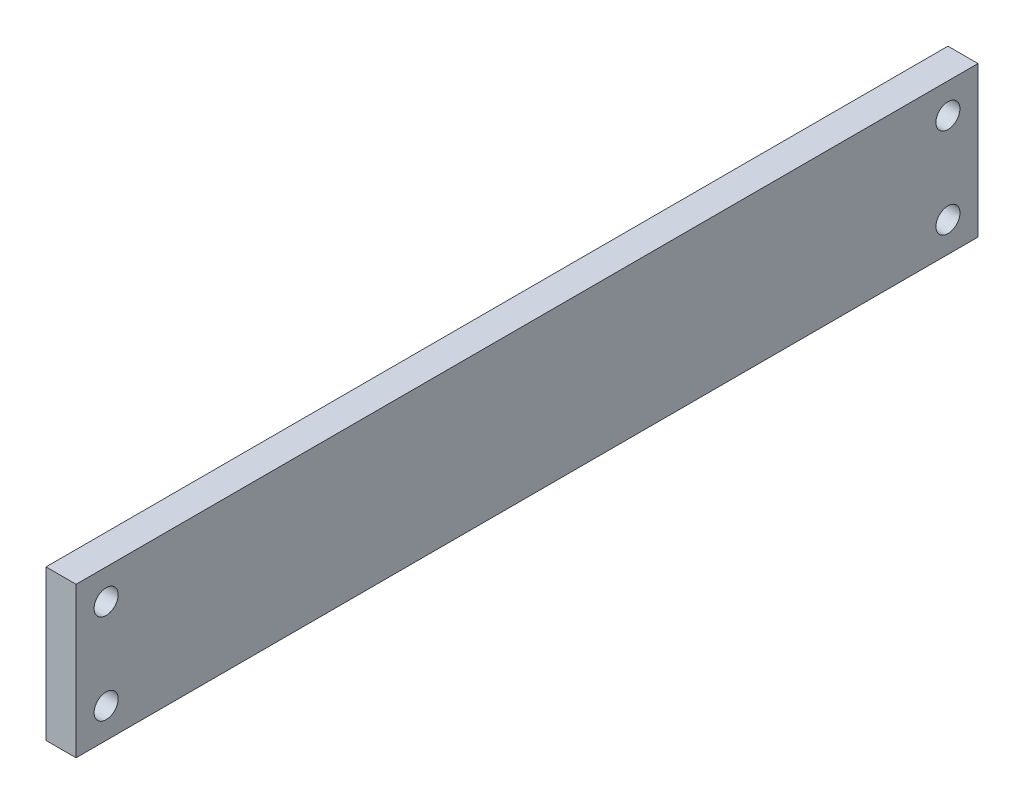
ISO-10303-21;
HEADER;
FILE_DESCRIPTION(('STEP AP214'),'2;1');
FILE_NAME('part.step','',(''),(''),'','','');
FILE_SCHEMA(('AUTOMOTIVE_DESIGN { 1 0 10303 214 1 1 1 1 }'));
ENDSEC;
DATA;
#1=APPLICATION_CONTEXT('core data for automotive mechanical design processes');
#2=APPLICATION_PROTOCOL_DEFINITION('international standard','automotive_design',2000,#1);
#3=PRODUCT_CONTEXT('',#1,'mechanical');
#4=PRODUCT('Part','Part','',(#3));
#5=PRODUCT_RELATED_PRODUCT_CATEGORY('part','',(#4));
#6=PRODUCT_DEFINITION_FORMATION('','',#4);
#7=PRODUCT_DEFINITION_CONTEXT('part definition',#1,'design');
#8=PRODUCT_DEFINITION('design','',#6,#7);
#9=PRODUCT_DEFINITION_SHAPE('','',#8);
#10=(LENGTH_UNIT() NAMED_UNIT(*) SI_UNIT(.MILLI.,.METRE.));
#11=(NAMED_UNIT(*) PLANE_ANGLE_UNIT() SI_UNIT($,.RADIAN.));
#12=(NAMED_UNIT(*) SI_UNIT($,.STERADIAN.) SOLID_ANGLE_UNIT());
#13=UNCERTAINTY_MEASURE_WITH_UNIT(LENGTH_MEASURE(1.E-05),#10,'distance_accuracy_value','');
#14=(GEOMETRIC_REPRESENTATION_CONTEXT(3) GLOBAL_UNCERTAINTY_ASSIGNED_CONTEXT((#13)) GLOBAL_UNIT_ASSIGNED_CONTEXT((#10,
#11,#12)) REPRESENTATION_CONTEXT('',''));
#15=CARTESIAN_POINT('',(0.,0.,0.));
#16=DIRECTION('',(0.,0.,1.));
#17=DIRECTION('',(1.,0.,0.));
#18=AXIS2_PLACEMENT_3D('',#15,#16,#17);
#19=CARTESIAN_POINT('',(5.,-12.5,-75.));
#20=DIRECTION('',(0.,0.,1.));
#21=DIRECTION('',(1.,0.,0.));
#22=AXIS2_PLACEMENT_3D('',#19,#20,#21);
#23=PLANE('',#22);
#24=DIRECTION('',(0.,1.,0.));
#25=VECTOR('',#24,1.);
#26=CARTESIAN_POINT('',(0.,-12.5,-75.));
#27=LINE('',#26,#25);
#28=CARTESIAN_POINT('',(0.,-12.5,-75.));
#29=VERTEX_POINT('',#28);
#30=CARTESIAN_POINT('',(0.,12.5,-75.));
#31=VERTEX_POINT('',#30);
#32=EDGE_CURVE('E96',#29,#31,#27,.T.);
#33=ORIENTED_EDGE('',*,*,#32,.T.);
#34=DIRECTION('',(-1.,0.,0.));
#35=VECTOR('',#34,1.);
#36=CARTESIAN_POINT('',(5.,12.5,-75.));
#37=LINE('',#36,#35);
#38=CARTESIAN_POINT('',(5.,12.5,-75.));
#39=VERTEX_POINT('',#38);
#40=EDGE_CURVE('E11',#39,#31,#37,.T.);
#41=ORIENTED_EDGE('',*,*,#40,.F.);
#42=DIRECTION('',(0.,1.,0.));
#43=VECTOR('',#42,1.);
#44=CARTESIAN_POINT('',(5.,-12.5,-75.));
#45=LINE('',#44,#43);
#46=CARTESIAN_POINT('',(5.,-12.5,-75.));
#47=VERTEX_POINT('',#46);
#48=EDGE_CURVE('E84',#47,#39,#45,.T.);
#49=ORIENTED_EDGE('',*,*,#48,.F.);
#50=DIRECTION('',(-1.,0.,0.));
#51=VECTOR('',#50,1.);
#52=CARTESIAN_POINT('',(5.,-12.5,-75.));
#53=LINE('',#52,#51);
#54=EDGE_CURVE('E92',#47,#29,#53,.T.);
#55=ORIENTED_EDGE('',*,*,#54,.T.);
#56=EDGE_LOOP('',(#33,#41,#49,#55));
#57=FACE_BOUND('',#56,.T.);
#58=ADVANCED_FACE('F33',(#57),#23,.F.);
#59=CARTESIAN_POINT('',(5.,12.5,-75.));
#60=DIRECTION('',(0.,-1.,0.));
#61=DIRECTION('',(0.,0.,-1.));
#62=AXIS2_PLACEMENT_3D('',#59,#60,#61);
#63=PLANE('',#62);
#64=DIRECTION('',(0.,0.,1.));
#65=VECTOR('',#64,1.);
#66=CARTESIAN_POINT('',(0.,12.5,-75.));
#67=LINE('',#66,#65);
#68=CARTESIAN_POINT('',(0.,12.5,75.));
#69=VERTEX_POINT('',#68);
#70=EDGE_CURVE('E88',#31,#69,#67,.T.);
#71=ORIENTED_EDGE('',*,*,#70,.T.);
#72=DIRECTION('',(-1.,0.,0.));
#73=VECTOR('',#72,1.);
#74=CARTESIAN_POINT('',(5.,12.5,75.));
#75=LINE('',#74,#73);
#76=CARTESIAN_POINT('',(5.,12.5,75.));
#77=VERTEX_POINT('',#76);
#78=EDGE_CURVE('E41',#77,#69,#75,.T.);
#79=ORIENTED_EDGE('',*,*,#78,.F.);
#80=DIRECTION('',(0.,0.,1.));
#81=VECTOR('',#80,1.);
#82=CARTESIAN_POINT('',(5.,12.5,-75.));
#83=LINE('',#82,#81);
#84=EDGE_CURVE('E79',#39,#77,#83,.T.);
#85=ORIENTED_EDGE('',*,*,#84,.F.);
#86=ORIENTED_EDGE('',*,*,#40,.T.);
#87=EDGE_LOOP('',(#71,#79,#85,#86));
#88=FACE_BOUND('',#87,.T.);
#89=ADVANCED_FACE('F87',(#88),#63,.F.);
#90=CARTESIAN_POINT('',(5.,-12.5,75.));
#91=DIRECTION('',(0.,0.,-1.));
#92=DIRECTION('',(-1.,0.,0.));
#93=AXIS2_PLACEMENT_3D('',#90,#91,#92);
#94=PLANE('',#93);
#95=DIRECTION('',(0.,-1.,0.));
#96=VECTOR('',#95,1.);
#97=CARTESIAN_POINT('',(0.,-12.5,75.));
#98=LINE('',#97,#96);
#99=CARTESIAN_POINT('',(0.,-12.5,75.));
#100=VERTEX_POINT('',#99);
#101=EDGE_CURVE('E66',#69,#100,#98,.T.);
#102=ORIENTED_EDGE('',*,*,#101,.T.);
#103=DIRECTION('',(-1.,0.,0.));
#104=VECTOR('',#103,1.);
#105=CARTESIAN_POINT('',(5.,-12.5,75.));
#106=LINE('',#105,#104);
#107=CARTESIAN_POINT('',(5.,-12.5,75.));
#108=VERTEX_POINT('',#107);
#109=EDGE_CURVE('E89',#108,#100,#106,.T.);
#110=ORIENTED_EDGE('',*,*,#109,.F.);
#111=DIRECTION('',(0.,-1.,0.));
#112=VECTOR('',#111,1.);
#113=CARTESIAN_POINT('',(5.,-12.5,75.));
#114=LINE('',#113,#112);
#115=EDGE_CURVE('E82',#77,#108,#114,.T.);
#116=ORIENTED_EDGE('',*,*,#115,.F.);
#117=ORIENTED_EDGE('',*,*,#78,.T.);
#118=EDGE_LOOP('',(#102,#110,#116,#117));
#119=FACE_BOUND('',#118,.T.);
#120=ADVANCED_FACE('F90',(#119),#94,.F.);
#121=CARTESIAN_POINT('',(5.,-12.5,-75.));
#122=DIRECTION('',(0.,1.,0.));
#123=DIRECTION('',(0.,0.,1.));
#124=AXIS2_PLACEMENT_3D('',#121,#122,#123);
#125=PLANE('',#124);
#126=DIRECTION('',(0.,0.,-1.));
#127=VECTOR('',#126,1.);
#128=CARTESIAN_POINT('',(0.,-12.5,-75.));
#129=LINE('',#128,#127);
#130=EDGE_CURVE('E72',#100,#29,#129,.T.);
#131=ORIENTED_EDGE('',*,*,#130,.T.);
#132=ORIENTED_EDGE('',*,*,#54,.F.);
#133=DIRECTION('',(0.,0.,-1.));
#134=VECTOR('',#133,1.);
#135=CARTESIAN_POINT('',(5.,-12.5,-75.));
#136=LINE('',#135,#134);
#137=EDGE_CURVE('E49',#108,#47,#136,.T.);
#138=ORIENTED_EDGE('',*,*,#137,.F.);
#139=ORIENTED_EDGE('',*,*,#109,.T.);
#140=EDGE_LOOP('',(#131,#132,#138,#139));
#141=FACE_BOUND('',#140,.T.);
#142=ADVANCED_FACE('F104',(#141),#125,.F.);
#143=CARTESIAN_POINT('',(5.,0.,0.));
#144=DIRECTION('',(1.,0.,0.));
#145=DIRECTION('',(0.,0.,-1.));
#146=AXIS2_PLACEMENT_3D('',#143,#144,#145);
#147=PLANE('',#146);
#148=CARTESIAN_POINT('',(5.,7.5,-70.));
#149=DIRECTION('',(1.,0.,0.));
#150=DIRECTION('',(0.,0.,-1.));
#151=AXIS2_PLACEMENT_3D('',#148,#149,#150);
#152=CIRCLE('',#151,2.);
#153=CARTESIAN_POINT('',(5.,7.5,-72.));
#154=VERTEX_POINT('',#153);
#155=EDGE_CURVE('E116',#154,#154,#152,.T.);
#156=ORIENTED_EDGE('',*,*,#155,.F.);
#157=EDGE_LOOP('',(#156));
#158=FACE_BOUND('',#157,.T.);
#159=CARTESIAN_POINT('',(5.,-7.5,-70.));
#160=DIRECTION('',(1.,0.,0.));
#161=DIRECTION('',(0.,0.,-1.));
#162=AXIS2_PLACEMENT_3D('',#159,#160,#161);
#163=CIRCLE('',#162,2.);
#164=CARTESIAN_POINT('',(5.,-7.5,-72.));
#165=VERTEX_POINT('',#164);
#166=EDGE_CURVE('E122',#165,#165,#163,.T.);
#167=ORIENTED_EDGE('',*,*,#166,.F.);
#168=EDGE_LOOP('',(#167));
#169=FACE_BOUND('',#168,.T.);
#170=CARTESIAN_POINT('',(5.,-7.5,70.));
#171=DIRECTION('',(1.,0.,0.));
#172=DIRECTION('',(0.,0.,-1.));
#173=AXIS2_PLACEMENT_3D('',#170,#171,#172);
#174=CIRCLE('',#173,2.);
#175=CARTESIAN_POINT('',(5.,-7.5,68.));
#176=VERTEX_POINT('',#175);
#177=EDGE_CURVE('E128',#176,#176,#174,.T.);
#178=ORIENTED_EDGE('',*,*,#177,.F.);
#179=EDGE_LOOP('',(#178));
#180=FACE_BOUND('',#179,.T.);
#181=CARTESIAN_POINT('',(5.,7.5,70.));
#182=DIRECTION('',(1.,0.,0.));
#183=DIRECTION('',(0.,0.,-1.));
#184=AXIS2_PLACEMENT_3D('',#181,#182,#183);
#185=CIRCLE('',#184,2.);
#186=CARTESIAN_POINT('',(5.,7.5,68.));
#187=VERTEX_POINT('',#186);
#188=EDGE_CURVE('E110',#187,#187,#185,.T.);
#189=ORIENTED_EDGE('',*,*,#188,.F.);
#190=EDGE_LOOP('',(#189));
#191=FACE_BOUND('',#190,.T.);
#192=ORIENTED_EDGE('',*,*,#48,.T.);
#193=ORIENTED_EDGE('',*,*,#84,.T.);
#194=ORIENTED_EDGE('',*,*,#115,.T.);
#195=ORIENTED_EDGE('',*,*,#137,.T.);
#196=EDGE_LOOP('',(#192,#193,#194,#195));
#197=FACE_BOUND('',#196,.T.);
#198=ADVANCED_FACE('F80',(#158,#169,#180,#191,#197),#147,.T.);
#199=CARTESIAN_POINT('',(0.,0.,0.));
#200=DIRECTION('',(1.,0.,0.));
#201=DIRECTION('',(0.,0.,-1.));
#202=AXIS2_PLACEMENT_3D('',#199,#200,#201);
#203=PLANE('',#202);
#204=CARTESIAN_POINT('',(0.,7.5,-70.));
#205=DIRECTION('',(1.,0.,0.));
#206=DIRECTION('',(0.,0.,-1.));
#207=AXIS2_PLACEMENT_3D('',#204,#205,#206);
#208=CIRCLE('',#207,2.);
#209=CARTESIAN_POINT('',(0.,7.5,-72.));
#210=VERTEX_POINT('',#209);
#211=EDGE_CURVE('E119',#210,#210,#208,.T.);
#212=ORIENTED_EDGE('',*,*,#211,.T.);
#213=EDGE_LOOP('',(#212));
#214=FACE_BOUND('',#213,.T.);
#215=CARTESIAN_POINT('',(0.,-7.5,-70.));
#216=DIRECTION('',(1.,0.,0.));
#217=DIRECTION('',(0.,0.,-1.));
#218=AXIS2_PLACEMENT_3D('',#215,#216,#217);
#219=CIRCLE('',#218,2.);
#220=CARTESIAN_POINT('',(0.,-7.5,-72.));
#221=VERTEX_POINT('',#220);
#222=EDGE_CURVE('E125',#221,#221,#219,.T.);
#223=ORIENTED_EDGE('',*,*,#222,.T.);
#224=EDGE_LOOP('',(#223));
#225=FACE_BOUND('',#224,.T.);
#226=CARTESIAN_POINT('',(0.,-7.5,70.));
#227=DIRECTION('',(1.,0.,0.));
#228=DIRECTION('',(0.,0.,-1.));
#229=AXIS2_PLACEMENT_3D('',#226,#227,#228);
#230=CIRCLE('',#229,2.);
#231=CARTESIAN_POINT('',(0.,-7.5,68.));
#232=VERTEX_POINT('',#231);
#233=EDGE_CURVE('E113',#232,#232,#230,.T.);
#234=ORIENTED_EDGE('',*,*,#233,.T.);
#235=EDGE_LOOP('',(#234));
#236=FACE_BOUND('',#235,.T.);
#237=CARTESIAN_POINT('',(0.,7.5,70.));
#238=DIRECTION('',(1.,0.,0.));
#239=DIRECTION('',(0.,0.,-1.));
#240=AXIS2_PLACEMENT_3D('',#237,#238,#239);
#241=CIRCLE('',#240,2.);
#242=CARTESIAN_POINT('',(0.,7.5,68.));
#243=VERTEX_POINT('',#242);
#244=EDGE_CURVE('E99',#243,#243,#241,.T.);
#245=ORIENTED_EDGE('',*,*,#244,.T.);
#246=EDGE_LOOP('',(#245));
#247=FACE_BOUND('',#246,.T.);
#248=ORIENTED_EDGE('',*,*,#32,.F.);
#249=ORIENTED_EDGE('',*,*,#130,.F.);
#250=ORIENTED_EDGE('',*,*,#101,.F.);
#251=ORIENTED_EDGE('',*,*,#70,.F.);
#252=EDGE_LOOP('',(#248,#249,#250,#251));
#253=FACE_BOUND('',#252,.T.);
#254=ADVANCED_FACE('F107',(#214,#225,#236,#247,#253),#203,.F.);
#255=CARTESIAN_POINT('',(0.,7.5,70.));
#256=DIRECTION('',(1.,0.,0.));
#257=DIRECTION('',(0.,0.,-1.));
#258=AXIS2_PLACEMENT_3D('',#255,#256,#257);
#259=CYLINDRICAL_SURFACE('',#258,2.);
#260=ORIENTED_EDGE('',*,*,#244,.F.);
#261=EDGE_LOOP('',(#260));
#262=FACE_BOUND('',#261,.T.);
#263=ORIENTED_EDGE('',*,*,#188,.T.);
#264=EDGE_LOOP('',(#263));
#265=FACE_BOUND('',#264,.T.);
#266=ADVANCED_FACE('F140',(#262,#265),#259,.F.);
#267=CARTESIAN_POINT('',(0.,-7.5,70.));
#268=DIRECTION('',(1.,0.,0.));
#269=DIRECTION('',(0.,0.,-1.));
#270=AXIS2_PLACEMENT_3D('',#267,#268,#269);
#271=CYLINDRICAL_SURFACE('',#270,2.);
#272=ORIENTED_EDGE('',*,*,#233,.F.);
#273=EDGE_LOOP('',(#272));
#274=FACE_BOUND('',#273,.T.);
#275=ORIENTED_EDGE('',*,*,#177,.T.);
#276=EDGE_LOOP('',(#275));
#277=FACE_BOUND('',#276,.T.);
#278=ADVANCED_FACE('F136',(#274,#277),#271,.F.);
#279=CARTESIAN_POINT('',(0.,-7.5,-70.));
#280=DIRECTION('',(1.,0.,0.));
#281=DIRECTION('',(0.,0.,-1.));
#282=AXIS2_PLACEMENT_3D('',#279,#280,#281);
#283=CYLINDRICAL_SURFACE('',#282,2.);
#284=ORIENTED_EDGE('',*,*,#222,.F.);
#285=EDGE_LOOP('',(#284));
#286=FACE_BOUND('',#285,.T.);
#287=ORIENTED_EDGE('',*,*,#166,.T.);
#288=EDGE_LOOP('',(#287));
#289=FACE_BOUND('',#288,.T.);
#290=ADVANCED_FACE('F139',(#286,#289),#283,.F.);
#291=CARTESIAN_POINT('',(0.,7.5,-70.));
#292=DIRECTION('',(1.,0.,0.));
#293=DIRECTION('',(0.,0.,-1.));
#294=AXIS2_PLACEMENT_3D('',#291,#292,#293);
#295=CYLINDRICAL_SURFACE('',#294,2.);
#296=ORIENTED_EDGE('',*,*,#211,.F.);
#297=EDGE_LOOP('',(#296));
#298=FACE_BOUND('',#297,.T.);
#299=ORIENTED_EDGE('',*,*,#155,.T.);
#300=EDGE_LOOP('',(#299));
#301=FACE_BOUND('',#300,.T.);
#302=ADVANCED_FACE('F201',(#298,#301),#295,.F.);
#303=CLOSED_SHELL('',(#58,#89,#120,#142,#198,#254,#266,#278,#290,#302));
#304=MANIFOLD_SOLID_BREP('B2',#303);
#305=ADVANCED_BREP_SHAPE_REPRESENTATION('',(#18,#304),#14);
#306=SHAPE_DEFINITION_REPRESENTATION(#9,#305);
ENDSEC;
END-ISO-10303-21;
